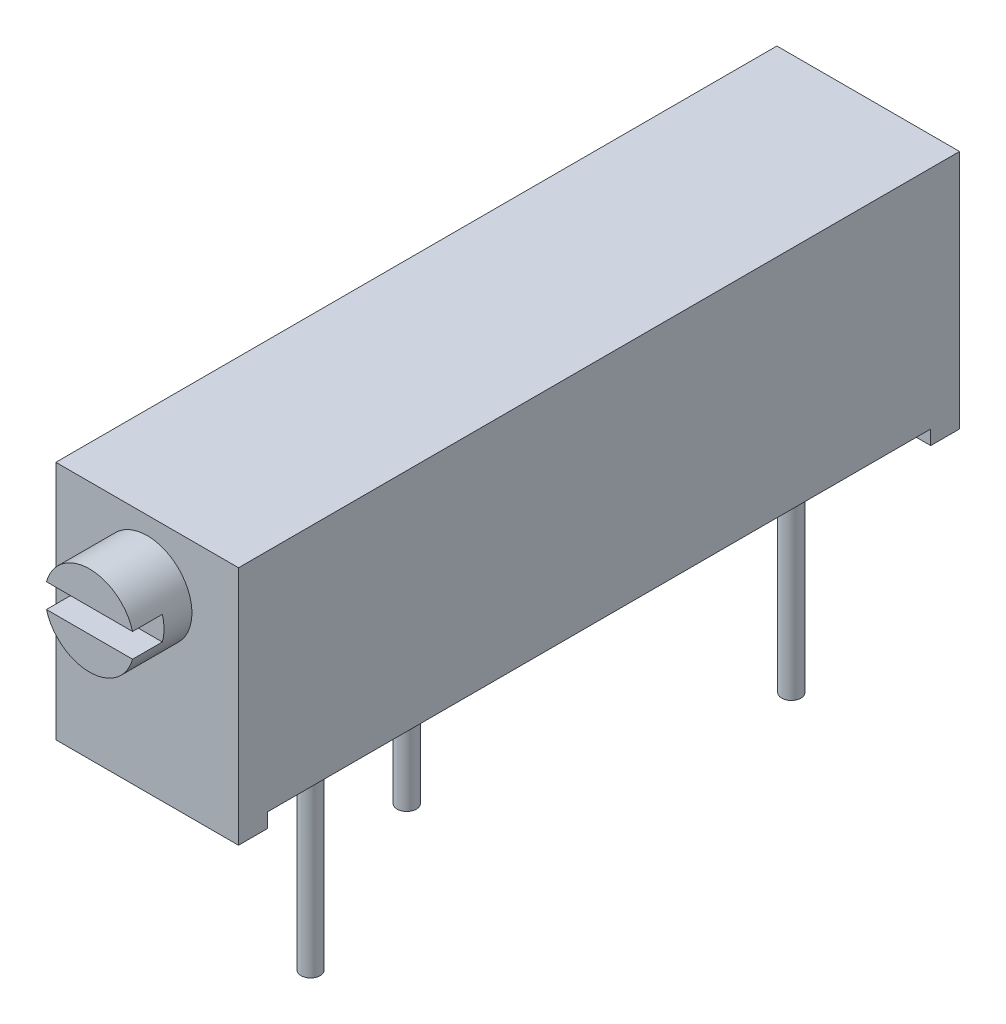
ISO-10303-21;
HEADER;
FILE_DESCRIPTION(('STEP AP214'),'2;1');
FILE_NAME('part.step','',(''),(''),'','','');
FILE_SCHEMA(('AUTOMOTIVE_DESIGN { 1 0 10303 214 1 1 1 1 }'));
ENDSEC;
DATA;
#1=APPLICATION_CONTEXT('core data for automotive mechanical design processes');
#2=APPLICATION_PROTOCOL_DEFINITION('international standard','automotive_design',2000,#1);
#3=PRODUCT_CONTEXT('',#1,'mechanical');
#4=PRODUCT('Part','Part','',(#3));
#5=PRODUCT_RELATED_PRODUCT_CATEGORY('part','',(#4));
#6=PRODUCT_DEFINITION_FORMATION('','',#4);
#7=PRODUCT_DEFINITION_CONTEXT('part definition',#1,'design');
#8=PRODUCT_DEFINITION('design','',#6,#7);
#9=PRODUCT_DEFINITION_SHAPE('','',#8);
#10=(LENGTH_UNIT() NAMED_UNIT(*) SI_UNIT(.MILLI.,.METRE.));
#11=(NAMED_UNIT(*) PLANE_ANGLE_UNIT() SI_UNIT($,.RADIAN.));
#12=(NAMED_UNIT(*) SI_UNIT($,.STERADIAN.) SOLID_ANGLE_UNIT());
#13=UNCERTAINTY_MEASURE_WITH_UNIT(LENGTH_MEASURE(1.E-05),#10,'distance_accuracy_value','');
#14=(GEOMETRIC_REPRESENTATION_CONTEXT(3) GLOBAL_UNCERTAINTY_ASSIGNED_CONTEXT((#13)) GLOBAL_UNIT_ASSIGNED_CONTEXT((#10,
#11,#12)) REPRESENTATION_CONTEXT('',''));
#15=CARTESIAN_POINT('',(0.,0.,0.));
#16=DIRECTION('',(0.,0.,1.));
#17=DIRECTION('',(1.,0.,0.));
#18=AXIS2_PLACEMENT_3D('',#15,#16,#17);
#19=CARTESIAN_POINT('',(2.413,-2.794,8.763));
#20=DIRECTION('',(0.,1.,0.));
#21=DIRECTION('',(0.,0.,1.));
#22=AXIS2_PLACEMENT_3D('',#19,#20,#21);
#23=PLANE('',#22);
#24=CARTESIAN_POINT('',(-1.524,-2.794,1.143));
#25=DIRECTION('',(0.,1.,0.));
#26=DIRECTION('',(0.,0.,1.));
#27=AXIS2_PLACEMENT_3D('',#24,#25,#26);
#28=CIRCLE('',#27,0.254);
#29=CARTESIAN_POINT('',(-1.524,-2.794,1.397));
#30=VERTEX_POINT('',#29);
#31=EDGE_CURVE('E41',#30,#30,#28,.F.);
#32=ORIENTED_EDGE('',*,*,#31,.F.);
#33=EDGE_LOOP('',(#32));
#34=FACE_BOUND('',#33,.T.);
#35=DIRECTION('',(0.,0.,-1.));
#36=VECTOR('',#35,1.);
#37=CARTESIAN_POINT('',(-2.413,-2.794,8.763));
#38=LINE('',#37,#36);
#39=CARTESIAN_POINT('',(-2.413,-2.794,8.763));
#40=VERTEX_POINT('',#39);
#41=CARTESIAN_POINT('',(-2.413,-2.794,-8.763));
#42=VERTEX_POINT('',#41);
#43=EDGE_CURVE('E150',#40,#42,#38,.T.);
#44=ORIENTED_EDGE('',*,*,#43,.T.);
#45=DIRECTION('',(-1.,0.,0.));
#46=VECTOR('',#45,1.);
#47=CARTESIAN_POINT('',(2.413,-2.794,-8.763));
#48=LINE('',#47,#46);
#49=CARTESIAN_POINT('',(2.413,-2.794,-8.763));
#50=VERTEX_POINT('',#49);
#51=EDGE_CURVE('E162',#50,#42,#48,.T.);
#52=ORIENTED_EDGE('',*,*,#51,.F.);
#53=DIRECTION('',(0.,0.,-1.));
#54=VECTOR('',#53,1.);
#55=CARTESIAN_POINT('',(2.413,-2.794,8.763));
#56=LINE('',#55,#54);
#57=CARTESIAN_POINT('',(2.413,-2.794,8.763));
#58=VERTEX_POINT('',#57);
#59=EDGE_CURVE('E283',#58,#50,#56,.T.);
#60=ORIENTED_EDGE('',*,*,#59,.F.);
#61=DIRECTION('',(-1.,0.,0.));
#62=VECTOR('',#61,1.);
#63=CARTESIAN_POINT('',(2.413,-2.794,8.763));
#64=LINE('',#63,#62);
#65=EDGE_CURVE('E165',#58,#40,#64,.T.);
#66=ORIENTED_EDGE('',*,*,#65,.T.);
#67=EDGE_LOOP('',(#44,#52,#60,#66));
#68=FACE_BOUND('',#67,.T.);
#69=CARTESIAN_POINT('',(1.016,-2.794,6.223));
#70=DIRECTION('',(0.,1.,0.));
#71=DIRECTION('',(0.,0.,1.));
#72=AXIS2_PLACEMENT_3D('',#69,#70,#71);
#73=CIRCLE('',#72,0.254);
#74=CARTESIAN_POINT('',(1.016,-2.794,6.477));
#75=VERTEX_POINT('',#74);
#76=EDGE_CURVE('E185',#75,#75,#73,.F.);
#77=ORIENTED_EDGE('',*,*,#76,.F.);
#78=EDGE_LOOP('',(#77));
#79=FACE_BOUND('',#78,.T.);
#80=CARTESIAN_POINT('',(1.016,-2.794,-6.477));
#81=DIRECTION('',(0.,1.,0.));
#82=DIRECTION('',(0.,0.,1.));
#83=AXIS2_PLACEMENT_3D('',#80,#81,#82);
#84=CIRCLE('',#83,0.254);
#85=CARTESIAN_POINT('',(1.016,-2.794,-6.223));
#86=VERTEX_POINT('',#85);
#87=EDGE_CURVE('E11',#86,#86,#84,.F.);
#88=ORIENTED_EDGE('',*,*,#87,.F.);
#89=EDGE_LOOP('',(#88));
#90=FACE_BOUND('',#89,.T.);
#91=ADVANCED_FACE('F33',(#34,#68,#79,#90),#23,.F.);
#92=CARTESIAN_POINT('',(0.,1.524,11.049));
#93=DIRECTION('',(0.,0.,1.));
#94=DIRECTION('',(1.,0.,0.));
#95=AXIS2_PLACEMENT_3D('',#92,#93,#94);
#96=PLANE('',#95);
#97=DIRECTION('',(-1.,0.,0.));
#98=VECTOR('',#97,1.);
#99=CARTESIAN_POINT('',(0.,1.8415,11.049));
#100=LINE('',#99,#98);
#101=CARTESIAN_POINT('',(1.13762514036918,1.8415,11.049));
#102=VERTEX_POINT('',#101);
#103=CARTESIAN_POINT('',(-1.13762514036918,1.8415,11.049));
#104=VERTEX_POINT('',#103);
#105=EDGE_CURVE('E178',#102,#104,#100,.T.);
#106=ORIENTED_EDGE('',*,*,#105,.F.);
#107=CARTESIAN_POINT('',(0.,1.524,11.049));
#108=DIRECTION('',(0.,0.,1.));
#109=DIRECTION('',(1.,0.,0.));
#110=AXIS2_PLACEMENT_3D('',#107,#108,#109);
#111=CIRCLE('',#110,1.1811);
#112=EDGE_CURVE('E146',#102,#104,#111,.T.);
#113=ORIENTED_EDGE('',*,*,#112,.T.);
#114=EDGE_LOOP('',(#106,#113));
#115=FACE_BOUND('',#114,.T.);
#116=ADVANCED_FACE('F194',(#115),#96,.T.);
#117=CARTESIAN_POINT('',(2.413,3.175,9.525));
#118=DIRECTION('',(0.,0.,-1.));
#119=DIRECTION('',(-1.,0.,0.));
#120=AXIS2_PLACEMENT_3D('',#117,#118,#119);
#121=PLANE('',#120);
#122=DIRECTION('',(0.,-1.,0.));
#123=VECTOR('',#122,1.);
#124=CARTESIAN_POINT('',(-2.413,3.175,9.525));
#125=LINE('',#124,#123);
#126=CARTESIAN_POINT('',(-2.413,3.175,9.525));
#127=VERTEX_POINT('',#126);
#128=CARTESIAN_POINT('',(-2.413,-3.175,9.525));
#129=VERTEX_POINT('',#128);
#130=EDGE_CURVE('E142',#127,#129,#125,.T.);
#131=ORIENTED_EDGE('',*,*,#130,.T.);
#132=DIRECTION('',(-1.,0.,0.));
#133=VECTOR('',#132,1.);
#134=CARTESIAN_POINT('',(2.413,-3.175,9.525));
#135=LINE('',#134,#133);
#136=CARTESIAN_POINT('',(2.413,-3.175,9.525));
#137=VERTEX_POINT('',#136);
#138=EDGE_CURVE('E171',#137,#129,#135,.T.);
#139=ORIENTED_EDGE('',*,*,#138,.F.);
#140=DIRECTION('',(0.,-1.,0.));
#141=VECTOR('',#140,1.);
#142=CARTESIAN_POINT('',(2.413,3.175,9.525));
#143=LINE('',#142,#141);
#144=CARTESIAN_POINT('',(2.413,3.175,9.525));
#145=VERTEX_POINT('',#144);
#146=EDGE_CURVE('E158',#145,#137,#143,.T.);
#147=ORIENTED_EDGE('',*,*,#146,.F.);
#148=DIRECTION('',(-1.,0.,0.));
#149=VECTOR('',#148,1.);
#150=CARTESIAN_POINT('',(2.413,3.175,9.525));
#151=LINE('',#150,#149);
#152=EDGE_CURVE('E138',#145,#127,#151,.T.);
#153=ORIENTED_EDGE('',*,*,#152,.T.);
#154=EDGE_LOOP('',(#131,#139,#147,#153));
#155=FACE_BOUND('',#154,.T.);
#156=CARTESIAN_POINT('',(0.,1.524,9.525));
#157=DIRECTION('',(0.,0.,-1.));
#158=DIRECTION('',(-1.,0.,0.));
#159=AXIS2_PLACEMENT_3D('',#156,#157,#158);
#160=CIRCLE('',#159,1.1811);
#161=CARTESIAN_POINT('',(-1.1811,1.524,9.525));
#162=VERTEX_POINT('',#161);
#163=EDGE_CURVE('E173',#162,#162,#160,.F.);
#164=ORIENTED_EDGE('',*,*,#163,.F.);
#165=EDGE_LOOP('',(#164));
#166=FACE_BOUND('',#165,.T.);
#167=ADVANCED_FACE('F35',(#155,#166),#121,.F.);
#168=CARTESIAN_POINT('',(2.413,-3.175,9.525));
#169=DIRECTION('',(0.,1.,0.));
#170=DIRECTION('',(0.,0.,1.));
#171=AXIS2_PLACEMENT_3D('',#168,#169,#170);
#172=PLANE('',#171);
#173=DIRECTION('',(0.,0.,-1.));
#174=VECTOR('',#173,1.);
#175=CARTESIAN_POINT('',(-2.413,-3.175,9.525));
#176=LINE('',#175,#174);
#177=CARTESIAN_POINT('',(-2.413,-3.175,8.763));
#178=VERTEX_POINT('',#177);
#179=EDGE_CURVE('E145',#129,#178,#176,.T.);
#180=ORIENTED_EDGE('',*,*,#179,.T.);
#181=DIRECTION('',(-1.,0.,0.));
#182=VECTOR('',#181,1.);
#183=CARTESIAN_POINT('',(2.413,-3.175,8.763));
#184=LINE('',#183,#182);
#185=CARTESIAN_POINT('',(2.413,-3.175,8.763));
#186=VERTEX_POINT('',#185);
#187=EDGE_CURVE('E168',#186,#178,#184,.T.);
#188=ORIENTED_EDGE('',*,*,#187,.F.);
#189=DIRECTION('',(0.,0.,-1.));
#190=VECTOR('',#189,1.);
#191=CARTESIAN_POINT('',(2.413,-3.175,9.525));
#192=LINE('',#191,#190);
#193=EDGE_CURVE('E99',#137,#186,#192,.T.);
#194=ORIENTED_EDGE('',*,*,#193,.F.);
#195=ORIENTED_EDGE('',*,*,#138,.T.);
#196=EDGE_LOOP('',(#180,#188,#194,#195));
#197=FACE_BOUND('',#196,.T.);
#198=ADVANCED_FACE('F268',(#197),#172,.F.);
#199=CARTESIAN_POINT('',(2.413,-2.794,8.763));
#200=DIRECTION('',(0.,0.,1.));
#201=DIRECTION('',(1.,0.,0.));
#202=AXIS2_PLACEMENT_3D('',#199,#200,#201);
#203=PLANE('',#202);
#204=DIRECTION('',(0.,1.,0.));
#205=VECTOR('',#204,1.);
#206=CARTESIAN_POINT('',(-2.413,-2.794,8.763));
#207=LINE('',#206,#205);
#208=EDGE_CURVE('E148',#178,#40,#207,.T.);
#209=ORIENTED_EDGE('',*,*,#208,.T.);
#210=ORIENTED_EDGE('',*,*,#65,.F.);
#211=DIRECTION('',(0.,1.,0.));
#212=VECTOR('',#211,1.);
#213=CARTESIAN_POINT('',(2.413,-2.794,8.763));
#214=LINE('',#213,#212);
#215=EDGE_CURVE('E280',#186,#58,#214,.T.);
#216=ORIENTED_EDGE('',*,*,#215,.F.);
#217=ORIENTED_EDGE('',*,*,#187,.T.);
#218=EDGE_LOOP('',(#209,#210,#216,#217));
#219=FACE_BOUND('',#218,.T.);
#220=ADVANCED_FACE('F264',(#219),#203,.F.);
#221=CARTESIAN_POINT('',(2.413,-2.794,-8.763));
#222=DIRECTION('',(0.,0.,-1.));
#223=DIRECTION('',(-1.,0.,0.));
#224=AXIS2_PLACEMENT_3D('',#221,#222,#223);
#225=PLANE('',#224);
#226=DIRECTION('',(0.,-1.,0.));
#227=VECTOR('',#226,1.);
#228=CARTESIAN_POINT('',(-2.413,-2.794,-8.763));
#229=LINE('',#228,#227);
#230=CARTESIAN_POINT('',(-2.413,-3.175,-8.763));
#231=VERTEX_POINT('',#230);
#232=EDGE_CURVE('E152',#42,#231,#229,.T.);
#233=ORIENTED_EDGE('',*,*,#232,.T.);
#234=DIRECTION('',(-1.,0.,0.));
#235=VECTOR('',#234,1.);
#236=CARTESIAN_POINT('',(2.413,-3.175,-8.763));
#237=LINE('',#236,#235);
#238=CARTESIAN_POINT('',(2.413,-3.175,-8.763));
#239=VERTEX_POINT('',#238);
#240=EDGE_CURVE('E133',#239,#231,#237,.T.);
#241=ORIENTED_EDGE('',*,*,#240,.F.);
#242=DIRECTION('',(0.,-1.,0.));
#243=VECTOR('',#242,1.);
#244=CARTESIAN_POINT('',(2.413,-2.794,-8.763));
#245=LINE('',#244,#243);
#246=EDGE_CURVE('E121',#50,#239,#245,.T.);
#247=ORIENTED_EDGE('',*,*,#246,.F.);
#248=ORIENTED_EDGE('',*,*,#51,.T.);
#249=EDGE_LOOP('',(#233,#241,#247,#248));
#250=FACE_BOUND('',#249,.T.);
#251=ADVANCED_FACE('F262',(#250),#225,.F.);
#252=CARTESIAN_POINT('',(2.413,-3.175,-8.763));
#253=DIRECTION('',(0.,1.,0.));
#254=DIRECTION('',(0.,0.,1.));
#255=AXIS2_PLACEMENT_3D('',#252,#253,#254);
#256=PLANE('',#255);
#257=DIRECTION('',(0.,0.,-1.));
#258=VECTOR('',#257,1.);
#259=CARTESIAN_POINT('',(-2.413,-3.175,-8.763));
#260=LINE('',#259,#258);
#261=CARTESIAN_POINT('',(-2.413,-3.175,-9.525));
#262=VERTEX_POINT('',#261);
#263=EDGE_CURVE('E130',#231,#262,#260,.T.);
#264=ORIENTED_EDGE('',*,*,#263,.T.);
#265=DIRECTION('',(-1.,0.,0.));
#266=VECTOR('',#265,1.);
#267=CARTESIAN_POINT('',(2.413,-3.175,-9.525));
#268=LINE('',#267,#266);
#269=CARTESIAN_POINT('',(2.413,-3.175,-9.525));
#270=VERTEX_POINT('',#269);
#271=EDGE_CURVE('E127',#270,#262,#268,.T.);
#272=ORIENTED_EDGE('',*,*,#271,.F.);
#273=DIRECTION('',(0.,0.,-1.));
#274=VECTOR('',#273,1.);
#275=CARTESIAN_POINT('',(2.413,-3.175,-8.763));
#276=LINE('',#275,#274);
#277=EDGE_CURVE('E114',#239,#270,#276,.T.);
#278=ORIENTED_EDGE('',*,*,#277,.F.);
#279=ORIENTED_EDGE('',*,*,#240,.T.);
#280=EDGE_LOOP('',(#264,#272,#278,#279));
#281=FACE_BOUND('',#280,.T.);
#282=ADVANCED_FACE('F128',(#281),#256,.F.);
#283=CARTESIAN_POINT('',(2.413,3.175,-9.525));
#284=DIRECTION('',(0.,0.,1.));
#285=DIRECTION('',(1.,0.,0.));
#286=AXIS2_PLACEMENT_3D('',#283,#284,#285);
#287=PLANE('',#286);
#288=DIRECTION('',(0.,1.,0.));
#289=VECTOR('',#288,1.);
#290=CARTESIAN_POINT('',(-2.413,3.175,-9.525));
#291=LINE('',#290,#289);
#292=CARTESIAN_POINT('',(-2.413,3.175,-9.525));
#293=VERTEX_POINT('',#292);
#294=EDGE_CURVE('E155',#262,#293,#291,.T.);
#295=ORIENTED_EDGE('',*,*,#294,.T.);
#296=DIRECTION('',(-1.,0.,0.));
#297=VECTOR('',#296,1.);
#298=CARTESIAN_POINT('',(2.413,3.175,-9.525));
#299=LINE('',#298,#297);
#300=CARTESIAN_POINT('',(2.413,3.175,-9.525));
#301=VERTEX_POINT('',#300);
#302=EDGE_CURVE('E134',#301,#293,#299,.T.);
#303=ORIENTED_EDGE('',*,*,#302,.F.);
#304=DIRECTION('',(0.,1.,0.));
#305=VECTOR('',#304,1.);
#306=CARTESIAN_POINT('',(2.413,3.175,-9.525));
#307=LINE('',#306,#305);
#308=EDGE_CURVE('E118',#270,#301,#307,.T.);
#309=ORIENTED_EDGE('',*,*,#308,.F.);
#310=ORIENTED_EDGE('',*,*,#271,.T.);
#311=EDGE_LOOP('',(#295,#303,#309,#310));
#312=FACE_BOUND('',#311,.T.);
#313=ADVANCED_FACE('F136',(#312),#287,.F.);
#314=CARTESIAN_POINT('',(2.413,3.175,9.525));
#315=DIRECTION('',(0.,-1.,0.));
#316=DIRECTION('',(0.,0.,-1.));
#317=AXIS2_PLACEMENT_3D('',#314,#315,#316);
#318=PLANE('',#317);
#319=DIRECTION('',(0.,0.,1.));
#320=VECTOR('',#319,1.);
#321=CARTESIAN_POINT('',(-2.413,3.175,9.525));
#322=LINE('',#321,#320);
#323=EDGE_CURVE('E90',#293,#127,#322,.T.);
#324=ORIENTED_EDGE('',*,*,#323,.T.);
#325=ORIENTED_EDGE('',*,*,#152,.F.);
#326=DIRECTION('',(0.,0.,1.));
#327=VECTOR('',#326,1.);
#328=CARTESIAN_POINT('',(2.413,3.175,9.525));
#329=LINE('',#328,#327);
#330=EDGE_CURVE('E57',#301,#145,#329,.T.);
#331=ORIENTED_EDGE('',*,*,#330,.F.);
#332=ORIENTED_EDGE('',*,*,#302,.T.);
#333=EDGE_LOOP('',(#324,#325,#331,#332));
#334=FACE_BOUND('',#333,.T.);
#335=ADVANCED_FACE('F252',(#334),#318,.F.);
#336=CARTESIAN_POINT('',(2.413,-3.175,9.525));
#337=DIRECTION('',(1.,0.,0.));
#338=DIRECTION('',(0.,0.,-1.));
#339=AXIS2_PLACEMENT_3D('',#336,#337,#338);
#340=PLANE('',#339);
#341=ORIENTED_EDGE('',*,*,#146,.T.);
#342=ORIENTED_EDGE('',*,*,#193,.T.);
#343=ORIENTED_EDGE('',*,*,#215,.T.);
#344=ORIENTED_EDGE('',*,*,#59,.T.);
#345=ORIENTED_EDGE('',*,*,#246,.T.);
#346=ORIENTED_EDGE('',*,*,#277,.T.);
#347=ORIENTED_EDGE('',*,*,#308,.T.);
#348=ORIENTED_EDGE('',*,*,#330,.T.);
#349=EDGE_LOOP('',(#341,#342,#343,#344,#345,#346,#347,#348));
#350=FACE_BOUND('',#349,.T.);
#351=ADVANCED_FACE('F116',(#350),#340,.T.);
#352=CARTESIAN_POINT('',(-2.413,-3.175,9.525));
#353=DIRECTION('',(1.,0.,0.));
#354=DIRECTION('',(0.,0.,-1.));
#355=AXIS2_PLACEMENT_3D('',#352,#353,#354);
#356=PLANE('',#355);
#357=ORIENTED_EDGE('',*,*,#130,.F.);
#358=ORIENTED_EDGE('',*,*,#323,.F.);
#359=ORIENTED_EDGE('',*,*,#294,.F.);
#360=ORIENTED_EDGE('',*,*,#263,.F.);
#361=ORIENTED_EDGE('',*,*,#232,.F.);
#362=ORIENTED_EDGE('',*,*,#43,.F.);
#363=ORIENTED_EDGE('',*,*,#208,.F.);
#364=ORIENTED_EDGE('',*,*,#179,.F.);
#365=EDGE_LOOP('',(#357,#358,#359,#360,#361,#362,#363,#364));
#366=FACE_BOUND('',#365,.T.);
#367=ADVANCED_FACE('F248',(#366),#356,.F.);
#368=CARTESIAN_POINT('',(0.,1.524,11.049));
#369=DIRECTION('',(0.,0.,-1.));
#370=DIRECTION('',(-1.,0.,0.));
#371=AXIS2_PLACEMENT_3D('',#368,#369,#370);
#372=CYLINDRICAL_SURFACE('',#371,1.1811);
#373=CARTESIAN_POINT('',(0.,1.524,10.2616));
#374=DIRECTION('',(0.,0.,1.));
#375=DIRECTION('',(1.,0.,0.));
#376=AXIS2_PLACEMENT_3D('',#373,#374,#375);
#377=CIRCLE('',#376,1.1811);
#378=CARTESIAN_POINT('',(-1.13762514036918,1.8415,10.2616));
#379=VERTEX_POINT('',#378);
#380=CARTESIAN_POINT('',(-1.13762514036918,1.2065,10.2616));
#381=VERTEX_POINT('',#380);
#382=EDGE_CURVE('E184',#379,#381,#377,.T.);
#383=ORIENTED_EDGE('',*,*,#382,.F.);
#384=DIRECTION('',(0.,0.,-1.));
#385=VECTOR('',#384,1.);
#386=CARTESIAN_POINT('',(-1.13762514036918,1.8415,11.049));
#387=LINE('',#386,#385);
#388=EDGE_CURVE('E295',#379,#104,#387,.F.);
#389=ORIENTED_EDGE('',*,*,#388,.T.);
#390=ORIENTED_EDGE('',*,*,#112,.F.);
#391=DIRECTION('',(0.,0.,-1.));
#392=VECTOR('',#391,1.);
#393=CARTESIAN_POINT('',(1.13762514036918,1.8415,11.049));
#394=LINE('',#393,#392);
#395=CARTESIAN_POINT('',(1.13762514036918,1.8415,10.2616));
#396=VERTEX_POINT('',#395);
#397=EDGE_CURVE('E292',#102,#396,#394,.T.);
#398=ORIENTED_EDGE('',*,*,#397,.T.);
#399=CARTESIAN_POINT('',(1.13762514036918,1.2065,10.2616));
#400=VERTEX_POINT('',#399);
#401=EDGE_CURVE('E181',#400,#396,#377,.T.);
#402=ORIENTED_EDGE('',*,*,#401,.F.);
#403=DIRECTION('',(0.,0.,-1.));
#404=VECTOR('',#403,1.);
#405=CARTESIAN_POINT('',(1.13762514036918,1.2065,11.049));
#406=LINE('',#405,#404);
#407=CARTESIAN_POINT('',(1.13762514036918,1.2065,11.049));
#408=VERTEX_POINT('',#407);
#409=EDGE_CURVE('E299',#400,#408,#406,.F.);
#410=ORIENTED_EDGE('',*,*,#409,.T.);
#411=CARTESIAN_POINT('',(-1.13762514036918,1.2065,11.049));
#412=VERTEX_POINT('',#411);
#413=EDGE_CURVE('E291',#412,#408,#111,.T.);
#414=ORIENTED_EDGE('',*,*,#413,.F.);
#415=DIRECTION('',(0.,0.,-1.));
#416=VECTOR('',#415,1.);
#417=CARTESIAN_POINT('',(-1.13762514036918,1.2065,11.049));
#418=LINE('',#417,#416);
#419=EDGE_CURVE('E48',#412,#381,#418,.T.);
#420=ORIENTED_EDGE('',*,*,#419,.T.);
#421=EDGE_LOOP('',(#383,#389,#390,#398,#402,#410,#414,#420));
#422=FACE_BOUND('',#421,.T.);
#423=ORIENTED_EDGE('',*,*,#163,.T.);
#424=EDGE_LOOP('',(#423));
#425=FACE_BOUND('',#424,.T.);
#426=ADVANCED_FACE('F244',(#422,#425),#372,.T.);
#427=DIRECTION('',(1.,0.,0.));
#428=VECTOR('',#427,1.);
#429=CARTESIAN_POINT('',(0.,1.2065,11.049));
#430=LINE('',#429,#428);
#431=EDGE_CURVE('E176',#412,#408,#430,.T.);
#432=ORIENTED_EDGE('',*,*,#431,.F.);
#433=ORIENTED_EDGE('',*,*,#413,.T.);
#434=EDGE_LOOP('',(#432,#433));
#435=FACE_BOUND('',#434,.T.);
#436=ADVANCED_FACE('F235',(#435),#96,.T.);
#437=CARTESIAN_POINT('',(-1.55795262267344,1.2065,10.2616));
#438=DIRECTION('',(0.,0.,1.));
#439=DIRECTION('',(1.,0.,0.));
#440=AXIS2_PLACEMENT_3D('',#437,#438,#439);
#441=PLANE('',#440);
#442=ORIENTED_EDGE('',*,*,#382,.T.);
#443=DIRECTION('',(1.,0.,0.));
#444=VECTOR('',#443,1.);
#445=CARTESIAN_POINT('',(-1.55795262267344,1.2065,10.2616));
#446=LINE('',#445,#444);
#447=EDGE_CURVE('E305',#381,#400,#446,.T.);
#448=ORIENTED_EDGE('',*,*,#447,.T.);
#449=ORIENTED_EDGE('',*,*,#401,.T.);
#450=DIRECTION('',(-1.,0.,0.));
#451=VECTOR('',#450,1.);
#452=CARTESIAN_POINT('',(-1.55795262267344,1.8415,10.2616));
#453=LINE('',#452,#451);
#454=EDGE_CURVE('E302',#396,#379,#453,.T.);
#455=ORIENTED_EDGE('',*,*,#454,.T.);
#456=EDGE_LOOP('',(#442,#448,#449,#455));
#457=FACE_BOUND('',#456,.T.);
#458=ADVANCED_FACE('F231',(#457),#441,.T.);
#459=CARTESIAN_POINT('',(-1.55795262267344,1.8415,10.2616));
#460=DIRECTION('',(0.,1.,0.));
#461=DIRECTION('',(0.,0.,1.));
#462=AXIS2_PLACEMENT_3D('',#459,#460,#461);
#463=PLANE('',#462);
#464=ORIENTED_EDGE('',*,*,#105,.T.);
#465=ORIENTED_EDGE('',*,*,#388,.F.);
#466=ORIENTED_EDGE('',*,*,#454,.F.);
#467=ORIENTED_EDGE('',*,*,#397,.F.);
#468=EDGE_LOOP('',(#464,#465,#466,#467));
#469=FACE_BOUND('',#468,.T.);
#470=ADVANCED_FACE('F234',(#469),#463,.F.);
#471=CARTESIAN_POINT('',(-1.55795262267344,1.2065,10.2616));
#472=DIRECTION('',(0.,-1.,0.));
#473=DIRECTION('',(0.,0.,-1.));
#474=AXIS2_PLACEMENT_3D('',#471,#472,#473);
#475=PLANE('',#474);
#476=ORIENTED_EDGE('',*,*,#431,.T.);
#477=ORIENTED_EDGE('',*,*,#409,.F.);
#478=ORIENTED_EDGE('',*,*,#447,.F.);
#479=ORIENTED_EDGE('',*,*,#419,.F.);
#480=EDGE_LOOP('',(#476,#477,#478,#479));
#481=FACE_BOUND('',#480,.T.);
#482=ADVANCED_FACE('F229',(#481),#475,.F.);
#483=CARTESIAN_POINT('',(1.016,-8.382,6.223));
#484=DIRECTION('',(0.,1.,0.));
#485=DIRECTION('',(0.,0.,1.));
#486=AXIS2_PLACEMENT_3D('',#483,#484,#485);
#487=CYLINDRICAL_SURFACE('',#486,0.254);
#488=CARTESIAN_POINT('',(1.016,-8.382,6.223));
#489=DIRECTION('',(0.,-1.,0.));
#490=DIRECTION('',(0.,0.,-1.));
#491=AXIS2_PLACEMENT_3D('',#488,#489,#490);
#492=CIRCLE('',#491,0.254);
#493=CARTESIAN_POINT('',(1.016,-8.382,5.969));
#494=VERTEX_POINT('',#493);
#495=EDGE_CURVE('E308',#494,#494,#492,.T.);
#496=ORIENTED_EDGE('',*,*,#495,.F.);
#497=EDGE_LOOP('',(#496));
#498=FACE_BOUND('',#497,.T.);
#499=ORIENTED_EDGE('',*,*,#76,.T.);
#500=EDGE_LOOP('',(#499));
#501=FACE_BOUND('',#500,.T.);
#502=ADVANCED_FACE('F225',(#498,#501),#487,.T.);
#503=CARTESIAN_POINT('',(1.016,-8.382,6.223));
#504=DIRECTION('',(0.,-1.,0.));
#505=DIRECTION('',(0.,0.,-1.));
#506=AXIS2_PLACEMENT_3D('',#503,#504,#505);
#507=PLANE('',#506);
#508=ORIENTED_EDGE('',*,*,#495,.T.);
#509=EDGE_LOOP('',(#508));
#510=FACE_BOUND('',#509,.T.);
#511=ADVANCED_FACE('F221',(#510),#507,.T.);
#512=CARTESIAN_POINT('',(-1.524,-8.382,1.143));
#513=DIRECTION('',(0.,1.,0.));
#514=DIRECTION('',(0.,0.,1.));
#515=AXIS2_PLACEMENT_3D('',#512,#513,#514);
#516=CYLINDRICAL_SURFACE('',#515,0.254);
#517=CARTESIAN_POINT('',(-1.524,-8.382,1.143));
#518=DIRECTION('',(0.,-1.,0.));
#519=DIRECTION('',(0.,0.,-1.));
#520=AXIS2_PLACEMENT_3D('',#517,#518,#519);
#521=CIRCLE('',#520,0.254);
#522=CARTESIAN_POINT('',(-1.524,-8.382,0.889000000000001));
#523=VERTEX_POINT('',#522);
#524=EDGE_CURVE('E311',#523,#523,#521,.T.);
#525=ORIENTED_EDGE('',*,*,#524,.F.);
#526=EDGE_LOOP('',(#525));
#527=FACE_BOUND('',#526,.T.);
#528=ORIENTED_EDGE('',*,*,#31,.T.);
#529=EDGE_LOOP('',(#528));
#530=FACE_BOUND('',#529,.T.);
#531=ADVANCED_FACE('F190',(#527,#530),#516,.T.);
#532=CARTESIAN_POINT('',(-1.524,-8.382,1.143));
#533=DIRECTION('',(0.,-1.,0.));
#534=DIRECTION('',(0.,0.,-1.));
#535=AXIS2_PLACEMENT_3D('',#532,#533,#534);
#536=PLANE('',#535);
#537=ORIENTED_EDGE('',*,*,#524,.T.);
#538=EDGE_LOOP('',(#537));
#539=FACE_BOUND('',#538,.T.);
#540=ADVANCED_FACE('F206',(#539),#536,.T.);
#541=CARTESIAN_POINT('',(1.016,-8.382,-6.477));
#542=DIRECTION('',(0.,1.,0.));
#543=DIRECTION('',(0.,0.,1.));
#544=AXIS2_PLACEMENT_3D('',#541,#542,#543);
#545=CYLINDRICAL_SURFACE('',#544,0.254);
#546=CARTESIAN_POINT('',(1.016,-8.382,-6.477));
#547=DIRECTION('',(0.,-1.,0.));
#548=DIRECTION('',(0.,0.,-1.));
#549=AXIS2_PLACEMENT_3D('',#546,#547,#548);
#550=CIRCLE('',#549,0.254);
#551=CARTESIAN_POINT('',(1.016,-8.382,-6.731));
#552=VERTEX_POINT('',#551);
#553=EDGE_CURVE('E314',#552,#552,#550,.T.);
#554=ORIENTED_EDGE('',*,*,#553,.F.);
#555=EDGE_LOOP('',(#554));
#556=FACE_BOUND('',#555,.T.);
#557=ORIENTED_EDGE('',*,*,#87,.T.);
#558=EDGE_LOOP('',(#557));
#559=FACE_BOUND('',#558,.T.);
#560=ADVANCED_FACE('F203',(#556,#559),#545,.T.);
#561=CARTESIAN_POINT('',(1.016,-8.382,-6.477));
#562=DIRECTION('',(0.,-1.,0.));
#563=DIRECTION('',(0.,0.,-1.));
#564=AXIS2_PLACEMENT_3D('',#561,#562,#563);
#565=PLANE('',#564);
#566=ORIENTED_EDGE('',*,*,#553,.T.);
#567=EDGE_LOOP('',(#566));
#568=FACE_BOUND('',#567,.T.);
#569=ADVANCED_FACE('F205',(#568),#565,.T.);
#570=CLOSED_SHELL('',(#91,#116,#167,#198,#220,#251,#282,#313,#335,#351,#367,#426,#436,#458,#470,
#482,#502,#511,#531,#540,#560,#569));
#571=MANIFOLD_SOLID_BREP('B2',#570);
#572=ADVANCED_BREP_SHAPE_REPRESENTATION('',(#18,#571),#14);
#573=SHAPE_DEFINITION_REPRESENTATION(#9,#572);
ENDSEC;
END-ISO-10303-21;
